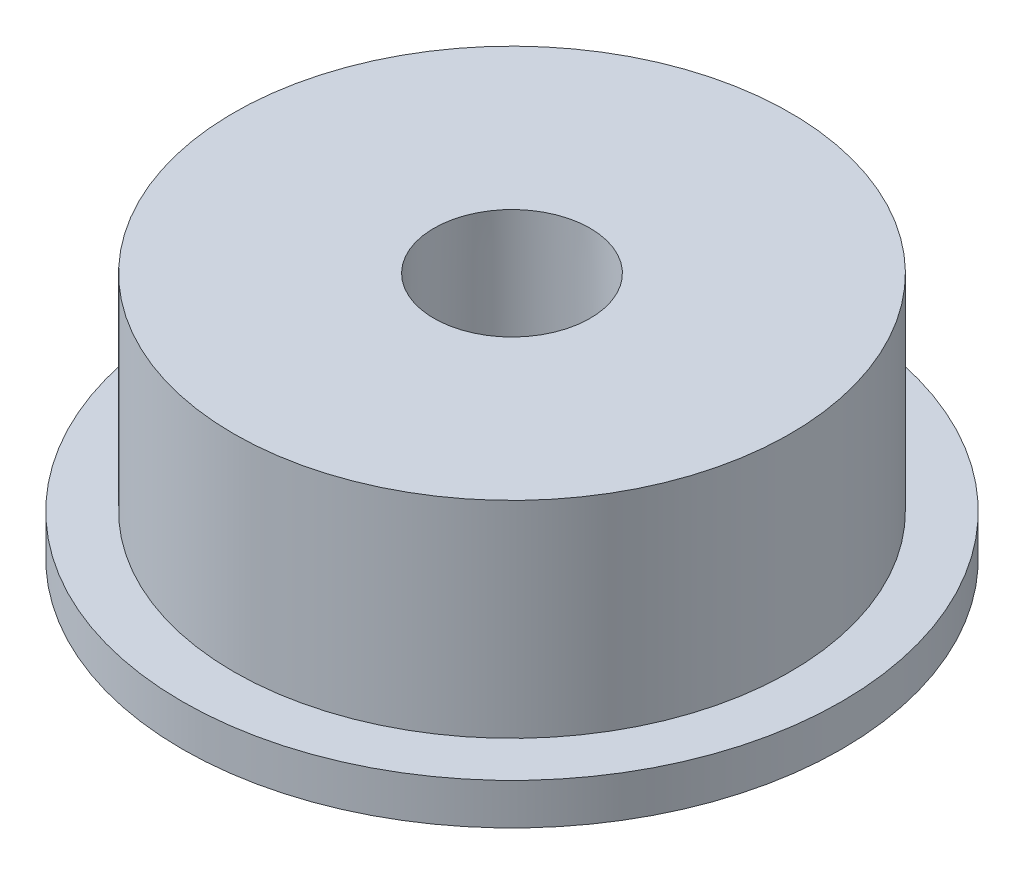
ISO-10303-21;
HEADER;
FILE_DESCRIPTION(('STEP AP214'),'2;1');
FILE_NAME('part.step','',(''),(''),'','','');
FILE_SCHEMA(('AUTOMOTIVE_DESIGN { 1 0 10303 214 1 1 1 1 }'));
ENDSEC;
DATA;
#1=APPLICATION_CONTEXT('core data for automotive mechanical design processes');
#2=APPLICATION_PROTOCOL_DEFINITION('international standard','automotive_design',2000,#1);
#3=PRODUCT_CONTEXT('',#1,'mechanical');
#4=PRODUCT('Part','Part','',(#3));
#5=PRODUCT_RELATED_PRODUCT_CATEGORY('part','',(#4));
#6=PRODUCT_DEFINITION_FORMATION('','',#4);
#7=PRODUCT_DEFINITION_CONTEXT('part definition',#1,'design');
#8=PRODUCT_DEFINITION('design','',#6,#7);
#9=PRODUCT_DEFINITION_SHAPE('','',#8);
#10=(LENGTH_UNIT() NAMED_UNIT(*) SI_UNIT(.MILLI.,.METRE.));
#11=(NAMED_UNIT(*) PLANE_ANGLE_UNIT() SI_UNIT($,.RADIAN.));
#12=(NAMED_UNIT(*) SI_UNIT($,.STERADIAN.) SOLID_ANGLE_UNIT());
#13=UNCERTAINTY_MEASURE_WITH_UNIT(LENGTH_MEASURE(1.E-05),#10,'distance_accuracy_value','');
#14=(GEOMETRIC_REPRESENTATION_CONTEXT(3) GLOBAL_UNCERTAINTY_ASSIGNED_CONTEXT((#13)) GLOBAL_UNIT_ASSIGNED_CONTEXT((#10,
#11,#12)) REPRESENTATION_CONTEXT('',''));
#15=CARTESIAN_POINT('',(0.,0.,0.));
#16=DIRECTION('',(0.,0.,1.));
#17=DIRECTION('',(1.,0.,0.));
#18=AXIS2_PLACEMENT_3D('',#15,#16,#17);
#19=CARTESIAN_POINT('',(0.,1.,0.));
#20=DIRECTION('',(0.,-1.,0.));
#21=DIRECTION('',(0.,0.,-1.));
#22=AXIS2_PLACEMENT_3D('',#19,#20,#21);
#23=CYLINDRICAL_SURFACE('',#22,8.);
#24=CARTESIAN_POINT('',(0.,1.,0.));
#25=DIRECTION('',(0.,1.,0.));
#26=DIRECTION('',(0.,0.,1.));
#27=AXIS2_PLACEMENT_3D('',#24,#25,#26);
#28=CIRCLE('',#27,8.);
#29=CARTESIAN_POINT('',(0.,1.,8.));
#30=VERTEX_POINT('',#29);
#31=EDGE_CURVE('E45',#30,#30,#28,.T.);
#32=ORIENTED_EDGE('',*,*,#31,.F.);
#33=EDGE_LOOP('',(#32));
#34=FACE_BOUND('',#33,.T.);
#35=CARTESIAN_POINT('',(0.,0.,0.));
#36=DIRECTION('',(0.,1.,0.));
#37=DIRECTION('',(0.,0.,1.));
#38=AXIS2_PLACEMENT_3D('',#35,#36,#37);
#39=CIRCLE('',#38,8.);
#40=CARTESIAN_POINT('',(0.,0.,8.));
#41=VERTEX_POINT('',#40);
#42=EDGE_CURVE('E40',#41,#41,#39,.T.);
#43=ORIENTED_EDGE('',*,*,#42,.T.);
#44=EDGE_LOOP('',(#43));
#45=FACE_BOUND('',#44,.T.);
#46=ADVANCED_FACE('F37',(#34,#45),#23,.T.);
#47=CARTESIAN_POINT('',(0.,1.,0.));
#48=DIRECTION('',(0.,1.,0.));
#49=DIRECTION('',(0.,0.,1.));
#50=AXIS2_PLACEMENT_3D('',#47,#48,#49);
#51=PLANE('',#50);
#52=CARTESIAN_POINT('',(0.,1.,0.));
#53=DIRECTION('',(0.,1.,0.));
#54=DIRECTION('',(0.,0.,1.));
#55=AXIS2_PLACEMENT_3D('',#52,#53,#54);
#56=CIRCLE('',#55,6.75);
#57=CARTESIAN_POINT('',(0.,1.,6.75));
#58=VERTEX_POINT('',#57);
#59=EDGE_CURVE('E10',#58,#58,#56,.T.);
#60=ORIENTED_EDGE('',*,*,#59,.F.);
#61=EDGE_LOOP('',(#60));
#62=FACE_BOUND('',#61,.T.);
#63=ORIENTED_EDGE('',*,*,#31,.T.);
#64=EDGE_LOOP('',(#63));
#65=FACE_BOUND('',#64,.T.);
#66=ADVANCED_FACE('F71',(#62,#65),#51,.T.);
#67=CARTESIAN_POINT('',(0.,0.,0.));
#68=DIRECTION('',(0.,1.,0.));
#69=DIRECTION('',(0.,0.,1.));
#70=AXIS2_PLACEMENT_3D('',#67,#68,#69);
#71=PLANE('',#70);
#72=CARTESIAN_POINT('',(0.,0.,0.));
#73=DIRECTION('',(0.,-1.,0.));
#74=DIRECTION('',(0.,0.,-1.));
#75=AXIS2_PLACEMENT_3D('',#72,#73,#74);
#76=CIRCLE('',#75,2.);
#77=CARTESIAN_POINT('',(0.,0.,-2.));
#78=VERTEX_POINT('',#77);
#79=EDGE_CURVE('E60',#78,#78,#76,.T.);
#80=ORIENTED_EDGE('',*,*,#79,.F.);
#81=EDGE_LOOP('',(#80));
#82=FACE_BOUND('',#81,.T.);
#83=ORIENTED_EDGE('',*,*,#42,.F.);
#84=EDGE_LOOP('',(#83));
#85=FACE_BOUND('',#84,.T.);
#86=ADVANCED_FACE('F67',(#82,#85),#71,.F.);
#87=CARTESIAN_POINT('',(0.,6.,0.));
#88=DIRECTION('',(0.,-1.,0.));
#89=DIRECTION('',(0.,0.,-1.));
#90=AXIS2_PLACEMENT_3D('',#87,#88,#89);
#91=CYLINDRICAL_SURFACE('',#90,6.75);
#92=CARTESIAN_POINT('',(0.,6.,0.));
#93=DIRECTION('',(0.,1.,0.));
#94=DIRECTION('',(0.,0.,1.));
#95=AXIS2_PLACEMENT_3D('',#92,#93,#94);
#96=CIRCLE('',#95,6.75);
#97=CARTESIAN_POINT('',(0.,6.,6.75));
#98=VERTEX_POINT('',#97);
#99=EDGE_CURVE('E52',#98,#98,#96,.T.);
#100=ORIENTED_EDGE('',*,*,#99,.F.);
#101=EDGE_LOOP('',(#100));
#102=FACE_BOUND('',#101,.T.);
#103=ORIENTED_EDGE('',*,*,#59,.T.);
#104=EDGE_LOOP('',(#103));
#105=FACE_BOUND('',#104,.T.);
#106=ADVANCED_FACE('F70',(#102,#105),#91,.T.);
#107=CARTESIAN_POINT('',(0.,6.,0.));
#108=DIRECTION('',(0.,1.,0.));
#109=DIRECTION('',(0.,0.,1.));
#110=AXIS2_PLACEMENT_3D('',#107,#108,#109);
#111=PLANE('',#110);
#112=CARTESIAN_POINT('',(0.,6.,0.));
#113=DIRECTION('',(0.,-1.,0.));
#114=DIRECTION('',(0.,0.,-1.));
#115=AXIS2_PLACEMENT_3D('',#112,#113,#114);
#116=CIRCLE('',#115,1.89526961043069);
#117=CARTESIAN_POINT('',(0.,6.,-1.89526961043069));
#118=VERTEX_POINT('',#117);
#119=EDGE_CURVE('E56',#118,#118,#116,.T.);
#120=ORIENTED_EDGE('',*,*,#119,.T.);
#121=EDGE_LOOP('',(#120));
#122=FACE_BOUND('',#121,.T.);
#123=ORIENTED_EDGE('',*,*,#99,.T.);
#124=EDGE_LOOP('',(#123));
#125=FACE_BOUND('',#124,.T.);
#126=ADVANCED_FACE('F90',(#122,#125),#111,.T.);
#127=CARTESIAN_POINT('',(0.,0.,0.));
#128=DIRECTION('',(0.,-1.,0.));
#129=DIRECTION('',(0.,0.,-1.));
#130=AXIS2_PLACEMENT_3D('',#127,#128,#129);
#131=CONICAL_SURFACE('',#130,2.,0.0174532925199433);
#132=ORIENTED_EDGE('',*,*,#119,.F.);
#133=EDGE_LOOP('',(#132));
#134=FACE_BOUND('',#133,.T.);
#135=ORIENTED_EDGE('',*,*,#79,.T.);
#136=EDGE_LOOP('',(#135));
#137=FACE_BOUND('',#136,.T.);
#138=ADVANCED_FACE('F65',(#134,#137),#131,.F.);
#139=CLOSED_SHELL('',(#46,#66,#86,#106,#126,#138));
#140=MANIFOLD_SOLID_BREP('B2',#139);
#141=ADVANCED_BREP_SHAPE_REPRESENTATION('',(#18,#140),#14);
#142=SHAPE_DEFINITION_REPRESENTATION(#9,#141);
ENDSEC;
END-ISO-10303-21;
